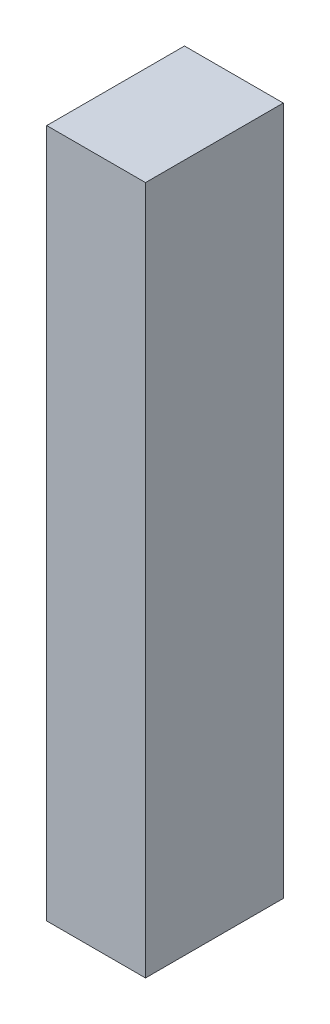
ISO-10303-21;
HEADER;
FILE_DESCRIPTION(('STEP AP214'),'2;1');
FILE_NAME('part.step','',(''),(''),'','','');
FILE_SCHEMA(('AUTOMOTIVE_DESIGN { 1 0 10303 214 1 1 1 1 }'));
ENDSEC;
DATA;
#1=APPLICATION_CONTEXT('core data for automotive mechanical design processes');
#2=APPLICATION_PROTOCOL_DEFINITION('international standard','automotive_design',2000,#1);
#3=PRODUCT_CONTEXT('',#1,'mechanical');
#4=PRODUCT('Part','Part','',(#3));
#5=PRODUCT_RELATED_PRODUCT_CATEGORY('part','',(#4));
#6=PRODUCT_DEFINITION_FORMATION('','',#4);
#7=PRODUCT_DEFINITION_CONTEXT('part definition',#1,'design');
#8=PRODUCT_DEFINITION('design','',#6,#7);
#9=PRODUCT_DEFINITION_SHAPE('','',#8);
#10=(LENGTH_UNIT() NAMED_UNIT(*) SI_UNIT(.MILLI.,.METRE.));
#11=(NAMED_UNIT(*) PLANE_ANGLE_UNIT() SI_UNIT($,.RADIAN.));
#12=(NAMED_UNIT(*) SI_UNIT($,.STERADIAN.) SOLID_ANGLE_UNIT());
#13=UNCERTAINTY_MEASURE_WITH_UNIT(LENGTH_MEASURE(1.E-05),#10,'distance_accuracy_value','');
#14=(GEOMETRIC_REPRESENTATION_CONTEXT(3) GLOBAL_UNCERTAINTY_ASSIGNED_CONTEXT((#13)) GLOBAL_UNIT_ASSIGNED_CONTEXT((#10,
#11,#12)) REPRESENTATION_CONTEXT('',''));
#15=CARTESIAN_POINT('',(0.,0.,0.));
#16=DIRECTION('',(0.,0.,1.));
#17=DIRECTION('',(1.,0.,0.));
#18=AXIS2_PLACEMENT_3D('',#15,#16,#17);
#19=CARTESIAN_POINT('',(0.,500.,0.));
#20=DIRECTION('',(1.,0.,0.));
#21=DIRECTION('',(0.,0.,-1.));
#22=AXIS2_PLACEMENT_3D('',#19,#20,#21);
#23=PLANE('',#22);
#24=DIRECTION('',(0.,0.,1.));
#25=VECTOR('',#24,1.);
#26=CARTESIAN_POINT('',(0.,0.,0.));
#27=LINE('',#26,#25);
#28=CARTESIAN_POINT('',(0.,0.,0.));
#29=VERTEX_POINT('',#28);
#30=CARTESIAN_POINT('',(0.,0.,100.));
#31=VERTEX_POINT('',#30);
#32=EDGE_CURVE('E104',#29,#31,#27,.T.);
#33=ORIENTED_EDGE('',*,*,#32,.T.);
#34=DIRECTION('',(0.,-1.,0.));
#35=VECTOR('',#34,1.);
#36=CARTESIAN_POINT('',(0.,500.,100.));
#37=LINE('',#36,#35);
#38=CARTESIAN_POINT('',(0.,500.,100.));
#39=VERTEX_POINT('',#38);
#40=EDGE_CURVE('E11',#39,#31,#37,.T.);
#41=ORIENTED_EDGE('',*,*,#40,.F.);
#42=DIRECTION('',(0.,0.,1.));
#43=VECTOR('',#42,1.);
#44=CARTESIAN_POINT('',(0.,500.,0.));
#45=LINE('',#44,#43);
#46=CARTESIAN_POINT('',(0.,500.,0.));
#47=VERTEX_POINT('',#46);
#48=EDGE_CURVE('E92',#47,#39,#45,.T.);
#49=ORIENTED_EDGE('',*,*,#48,.F.);
#50=DIRECTION('',(0.,-1.,0.));
#51=VECTOR('',#50,1.);
#52=CARTESIAN_POINT('',(0.,500.,0.));
#53=LINE('',#52,#51);
#54=EDGE_CURVE('E100',#47,#29,#53,.T.);
#55=ORIENTED_EDGE('',*,*,#54,.T.);
#56=EDGE_LOOP('',(#33,#41,#49,#55));
#57=FACE_BOUND('',#56,.T.);
#58=ADVANCED_FACE('F41',(#57),#23,.F.);
#59=CARTESIAN_POINT('',(0.,500.,100.));
#60=DIRECTION('',(0.,0.,-1.));
#61=DIRECTION('',(-1.,0.,0.));
#62=AXIS2_PLACEMENT_3D('',#59,#60,#61);
#63=PLANE('',#62);
#64=DIRECTION('',(1.,0.,0.));
#65=VECTOR('',#64,1.);
#66=CARTESIAN_POINT('',(0.,0.,100.));
#67=LINE('',#66,#65);
#68=CARTESIAN_POINT('',(71.7,0.,100.));
#69=VERTEX_POINT('',#68);
#70=EDGE_CURVE('E96',#31,#69,#67,.T.);
#71=ORIENTED_EDGE('',*,*,#70,.T.);
#72=DIRECTION('',(0.,-1.,0.));
#73=VECTOR('',#72,1.);
#74=CARTESIAN_POINT('',(71.7,500.,100.));
#75=LINE('',#74,#73);
#76=CARTESIAN_POINT('',(71.7,500.,100.));
#77=VERTEX_POINT('',#76);
#78=EDGE_CURVE('E49',#77,#69,#75,.T.);
#79=ORIENTED_EDGE('',*,*,#78,.F.);
#80=DIRECTION('',(1.,0.,0.));
#81=VECTOR('',#80,1.);
#82=CARTESIAN_POINT('',(0.,500.,100.));
#83=LINE('',#82,#81);
#84=EDGE_CURVE('E87',#39,#77,#83,.T.);
#85=ORIENTED_EDGE('',*,*,#84,.F.);
#86=ORIENTED_EDGE('',*,*,#40,.T.);
#87=EDGE_LOOP('',(#71,#79,#85,#86));
#88=FACE_BOUND('',#87,.T.);
#89=ADVANCED_FACE('F95',(#88),#63,.F.);
#90=CARTESIAN_POINT('',(71.7,500.,0.));
#91=DIRECTION('',(-1.,0.,0.));
#92=DIRECTION('',(0.,0.,1.));
#93=AXIS2_PLACEMENT_3D('',#90,#91,#92);
#94=PLANE('',#93);
#95=DIRECTION('',(0.,0.,-1.));
#96=VECTOR('',#95,1.);
#97=CARTESIAN_POINT('',(71.7,0.,0.));
#98=LINE('',#97,#96);
#99=CARTESIAN_POINT('',(71.7,0.,0.));
#100=VERTEX_POINT('',#99);
#101=EDGE_CURVE('E74',#69,#100,#98,.T.);
#102=ORIENTED_EDGE('',*,*,#101,.T.);
#103=DIRECTION('',(0.,-1.,0.));
#104=VECTOR('',#103,1.);
#105=CARTESIAN_POINT('',(71.7,500.,0.));
#106=LINE('',#105,#104);
#107=CARTESIAN_POINT('',(71.7,500.,0.));
#108=VERTEX_POINT('',#107);
#109=EDGE_CURVE('E97',#108,#100,#106,.T.);
#110=ORIENTED_EDGE('',*,*,#109,.F.);
#111=DIRECTION('',(0.,0.,-1.));
#112=VECTOR('',#111,1.);
#113=CARTESIAN_POINT('',(71.7,500.,0.));
#114=LINE('',#113,#112);
#115=EDGE_CURVE('E90',#77,#108,#114,.T.);
#116=ORIENTED_EDGE('',*,*,#115,.F.);
#117=ORIENTED_EDGE('',*,*,#78,.T.);
#118=EDGE_LOOP('',(#102,#110,#116,#117));
#119=FACE_BOUND('',#118,.T.);
#120=ADVANCED_FACE('F98',(#119),#94,.F.);
#121=CARTESIAN_POINT('',(0.,500.,0.));
#122=DIRECTION('',(0.,0.,1.));
#123=DIRECTION('',(1.,0.,0.));
#124=AXIS2_PLACEMENT_3D('',#121,#122,#123);
#125=PLANE('',#124);
#126=DIRECTION('',(-1.,0.,0.));
#127=VECTOR('',#126,1.);
#128=CARTESIAN_POINT('',(0.,0.,0.));
#129=LINE('',#128,#127);
#130=EDGE_CURVE('E80',#100,#29,#129,.T.);
#131=ORIENTED_EDGE('',*,*,#130,.T.);
#132=ORIENTED_EDGE('',*,*,#54,.F.);
#133=DIRECTION('',(-1.,0.,0.));
#134=VECTOR('',#133,1.);
#135=CARTESIAN_POINT('',(0.,500.,0.));
#136=LINE('',#135,#134);
#137=EDGE_CURVE('E57',#108,#47,#136,.T.);
#138=ORIENTED_EDGE('',*,*,#137,.F.);
#139=ORIENTED_EDGE('',*,*,#109,.T.);
#140=EDGE_LOOP('',(#131,#132,#138,#139));
#141=FACE_BOUND('',#140,.T.);
#142=ADVANCED_FACE('F111',(#141),#125,.F.);
#143=CARTESIAN_POINT('',(0.,500.,0.));
#144=DIRECTION('',(0.,1.,0.));
#145=DIRECTION('',(0.,0.,1.));
#146=AXIS2_PLACEMENT_3D('',#143,#144,#145);
#147=PLANE('',#146);
#148=ORIENTED_EDGE('',*,*,#48,.T.);
#149=ORIENTED_EDGE('',*,*,#84,.T.);
#150=ORIENTED_EDGE('',*,*,#115,.T.);
#151=ORIENTED_EDGE('',*,*,#137,.T.);
#152=EDGE_LOOP('',(#148,#149,#150,#151));
#153=FACE_BOUND('',#152,.T.);
#154=ADVANCED_FACE('F88',(#153),#147,.T.);
#155=CARTESIAN_POINT('',(0.,0.,0.));
#156=DIRECTION('',(0.,1.,0.));
#157=DIRECTION('',(0.,0.,1.));
#158=AXIS2_PLACEMENT_3D('',#155,#156,#157);
#159=PLANE('',#158);
#160=ORIENTED_EDGE('',*,*,#32,.F.);
#161=ORIENTED_EDGE('',*,*,#130,.F.);
#162=ORIENTED_EDGE('',*,*,#101,.F.);
#163=ORIENTED_EDGE('',*,*,#70,.F.);
#164=EDGE_LOOP('',(#160,#161,#162,#163));
#165=FACE_BOUND('',#164,.T.);
#166=ADVANCED_FACE('F114',(#165),#159,.F.);
#167=CLOSED_SHELL('',(#58,#89,#120,#142,#154,#166));
#168=MANIFOLD_SOLID_BREP('B2',#167);
#169=ADVANCED_BREP_SHAPE_REPRESENTATION('',(#18,#168),#14);
#170=SHAPE_DEFINITION_REPRESENTATION(#9,#169);
ENDSEC;
END-ISO-10303-21;
